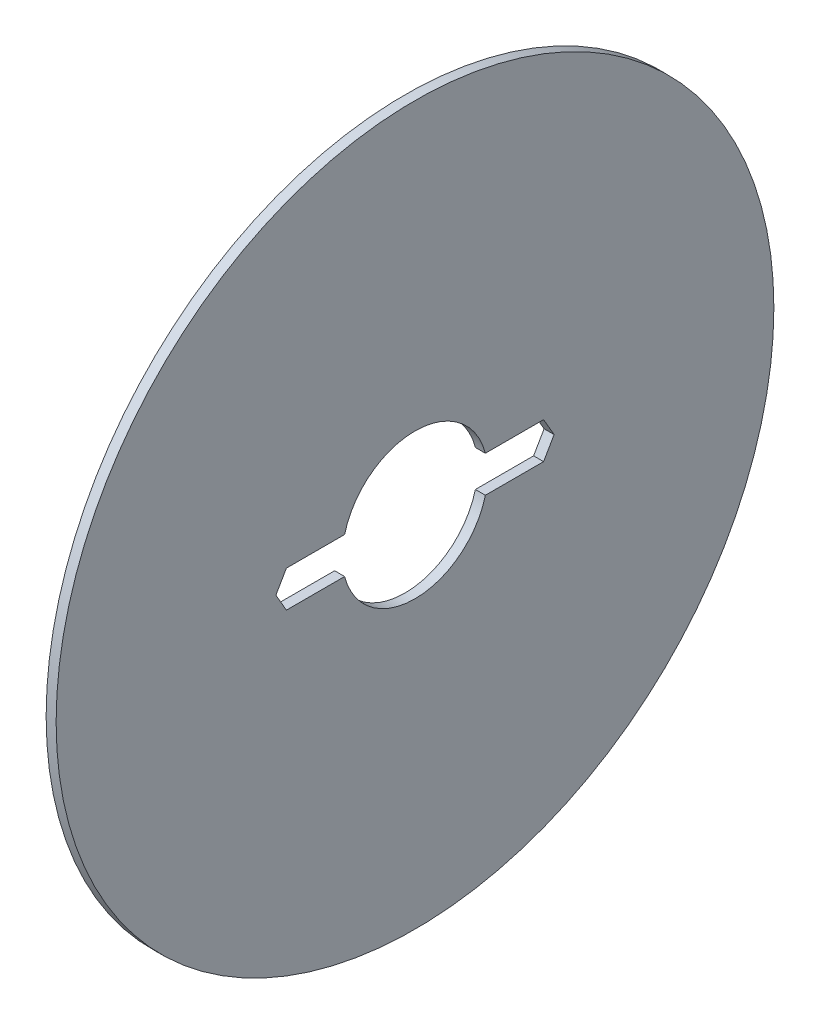
ISO-10303-21;
HEADER;
FILE_DESCRIPTION(('STEP AP214'),'2;1');
FILE_NAME('part.step','',(''),(''),'','','');
FILE_SCHEMA(('AUTOMOTIVE_DESIGN { 1 0 10303 214 1 1 1 1 }'));
ENDSEC;
DATA;
#1=APPLICATION_CONTEXT('core data for automotive mechanical design processes');
#2=APPLICATION_PROTOCOL_DEFINITION('international standard','automotive_design',2000,#1);
#3=PRODUCT_CONTEXT('',#1,'mechanical');
#4=PRODUCT('Part','Part','',(#3));
#5=PRODUCT_RELATED_PRODUCT_CATEGORY('part','',(#4));
#6=PRODUCT_DEFINITION_FORMATION('','',#4);
#7=PRODUCT_DEFINITION_CONTEXT('part definition',#1,'design');
#8=PRODUCT_DEFINITION('design','',#6,#7);
#9=PRODUCT_DEFINITION_SHAPE('','',#8);
#10=(LENGTH_UNIT() NAMED_UNIT(*) SI_UNIT(.MILLI.,.METRE.));
#11=(NAMED_UNIT(*) PLANE_ANGLE_UNIT() SI_UNIT($,.RADIAN.));
#12=(NAMED_UNIT(*) SI_UNIT($,.STERADIAN.) SOLID_ANGLE_UNIT());
#13=UNCERTAINTY_MEASURE_WITH_UNIT(LENGTH_MEASURE(1.E-05),#10,'distance_accuracy_value','');
#14=(GEOMETRIC_REPRESENTATION_CONTEXT(3) GLOBAL_UNCERTAINTY_ASSIGNED_CONTEXT((#13)) GLOBAL_UNIT_ASSIGNED_CONTEXT((#10,
#11,#12)) REPRESENTATION_CONTEXT('',''));
#15=CARTESIAN_POINT('',(0.,0.,0.));
#16=DIRECTION('',(0.,0.,1.));
#17=DIRECTION('',(1.,0.,0.));
#18=AXIS2_PLACEMENT_3D('',#15,#16,#17);
#19=CARTESIAN_POINT('',(0.55,0.,0.));
#20=DIRECTION('',(1.,0.,0.));
#21=DIRECTION('',(0.,0.,-1.));
#22=AXIS2_PLACEMENT_3D('',#19,#20,#21);
#23=PLANE('',#22);
#24=CARTESIAN_POINT('',(0.55,0.,0.));
#25=DIRECTION('',(1.,0.,0.));
#26=DIRECTION('',(0.,0.,-1.));
#27=AXIS2_PLACEMENT_3D('',#24,#25,#26);
#28=CIRCLE('',#27,19.75);
#29=CARTESIAN_POINT('',(0.55,0.,-19.75));
#30=VERTEX_POINT('',#29);
#31=EDGE_CURVE('E11',#30,#30,#28,.T.);
#32=ORIENTED_EDGE('',*,*,#31,.T.);
#33=EDGE_LOOP('',(#32));
#34=FACE_BOUND('',#33,.T.);
#35=DIRECTION('',(0.,0.,1.));
#36=VECTOR('',#35,1.);
#37=CARTESIAN_POINT('',(0.55,1.,3.87298334620742));
#38=LINE('',#37,#36);
#39=CARTESIAN_POINT('',(0.55,1.,3.87298334620742));
#40=VERTEX_POINT('',#39);
#41=CARTESIAN_POINT('',(0.55,1.,7.07735026918962));
#42=VERTEX_POINT('',#41);
#43=EDGE_CURVE('E125',#40,#42,#38,.T.);
#44=ORIENTED_EDGE('',*,*,#43,.F.);
#45=CARTESIAN_POINT('',(0.55,0.,0.));
#46=DIRECTION('',(1.,0.,0.));
#47=DIRECTION('',(0.,0.,-1.));
#48=AXIS2_PLACEMENT_3D('',#45,#46,#47);
#49=CIRCLE('',#48,4.);
#50=CARTESIAN_POINT('',(0.55,1.,-3.87298334620742));
#51=VERTEX_POINT('',#50);
#52=EDGE_CURVE('E116',#51,#40,#49,.T.);
#53=ORIENTED_EDGE('',*,*,#52,.F.);
#54=DIRECTION('',(0.,0.,1.));
#55=VECTOR('',#54,1.);
#56=CARTESIAN_POINT('',(0.55,1.,-7.07735026918962));
#57=LINE('',#56,#55);
#58=CARTESIAN_POINT('',(0.55,0.999999999999999,-7.07735026918962));
#59=VERTEX_POINT('',#58);
#60=EDGE_CURVE('E163',#59,#51,#57,.T.);
#61=ORIENTED_EDGE('',*,*,#60,.F.);
#62=DIRECTION('',(0.,0.866025403784438,0.5));
#63=VECTOR('',#62,1.);
#64=CARTESIAN_POINT('',(0.55,0.,-7.65470053837925));
#65=LINE('',#64,#63);
#66=CARTESIAN_POINT('',(0.55,0.,-7.65470053837925));
#67=VERTEX_POINT('',#66);
#68=EDGE_CURVE('E160',#67,#59,#65,.T.);
#69=ORIENTED_EDGE('',*,*,#68,.F.);
#70=DIRECTION('',(0.,0.866025403784439,-0.5));
#71=VECTOR('',#70,1.);
#72=CARTESIAN_POINT('',(0.55,-1.,-7.07735026918963));
#73=LINE('',#72,#71);
#74=CARTESIAN_POINT('',(0.55,-1.,-7.07735026918963));
#75=VERTEX_POINT('',#74);
#76=EDGE_CURVE('E157',#75,#67,#73,.T.);
#77=ORIENTED_EDGE('',*,*,#76,.F.);
#78=DIRECTION('',(0.,0.,-1.));
#79=VECTOR('',#78,1.);
#80=CARTESIAN_POINT('',(0.55,-1.,-5.92264973081037));
#81=LINE('',#80,#79);
#82=CARTESIAN_POINT('',(0.55,-1.,-3.87298334620742));
#83=VERTEX_POINT('',#82);
#84=EDGE_CURVE('E154',#83,#75,#81,.T.);
#85=ORIENTED_EDGE('',*,*,#84,.F.);
#86=CARTESIAN_POINT('',(0.55,0.,0.));
#87=DIRECTION('',(1.,0.,0.));
#88=DIRECTION('',(0.,0.,-1.));
#89=AXIS2_PLACEMENT_3D('',#86,#87,#88);
#90=CIRCLE('',#89,4.);
#91=CARTESIAN_POINT('',(0.55,-1.,3.87298334620742));
#92=VERTEX_POINT('',#91);
#93=EDGE_CURVE('E151',#92,#83,#90,.T.);
#94=ORIENTED_EDGE('',*,*,#93,.F.);
#95=DIRECTION('',(0.,0.,-1.));
#96=VECTOR('',#95,1.);
#97=CARTESIAN_POINT('',(0.55,-0.999999999999999,7.07735026918963));
#98=LINE('',#97,#96);
#99=CARTESIAN_POINT('',(0.55,-0.999999999999999,7.07735026918963));
#100=VERTEX_POINT('',#99);
#101=EDGE_CURVE('E148',#100,#92,#98,.T.);
#102=ORIENTED_EDGE('',*,*,#101,.F.);
#103=DIRECTION('',(0.,-0.86602540378444,-0.499999999999998));
#104=VECTOR('',#103,1.);
#105=CARTESIAN_POINT('',(0.55,0.,7.65470053837925));
#106=LINE('',#105,#104);
#107=CARTESIAN_POINT('',(0.55,0.,7.65470053837925));
#108=VERTEX_POINT('',#107);
#109=EDGE_CURVE('E143',#108,#100,#106,.T.);
#110=ORIENTED_EDGE('',*,*,#109,.F.);
#111=DIRECTION('',(0.,-0.866025403784438,0.500000000000002));
#112=VECTOR('',#111,1.);
#113=CARTESIAN_POINT('',(0.55,1.,7.07735026918962));
#114=LINE('',#113,#112);
#115=EDGE_CURVE('E138',#42,#108,#114,.T.);
#116=ORIENTED_EDGE('',*,*,#115,.F.);
#117=EDGE_LOOP('',(#44,#53,#61,#69,#77,#85,#94,#102,#110,#116));
#118=FACE_BOUND('',#117,.T.);
#119=ADVANCED_FACE('F38',(#34,#118),#23,.T.);
#120=CARTESIAN_POINT('',(0.,0.,0.));
#121=DIRECTION('',(1.,0.,0.));
#122=DIRECTION('',(0.,0.,-1.));
#123=AXIS2_PLACEMENT_3D('',#120,#121,#122);
#124=PLANE('',#123);
#125=CARTESIAN_POINT('',(0.,0.,0.));
#126=DIRECTION('',(1.,0.,0.));
#127=DIRECTION('',(0.,0.,-1.));
#128=AXIS2_PLACEMENT_3D('',#125,#126,#127);
#129=CIRCLE('',#128,19.75);
#130=CARTESIAN_POINT('',(0.,0.,-19.75));
#131=VERTEX_POINT('',#130);
#132=EDGE_CURVE('E42',#131,#131,#129,.T.);
#133=ORIENTED_EDGE('',*,*,#132,.F.);
#134=EDGE_LOOP('',(#133));
#135=FACE_BOUND('',#134,.T.);
#136=CARTESIAN_POINT('',(0.,0.,0.));
#137=DIRECTION('',(1.,0.,0.));
#138=DIRECTION('',(0.,0.,-1.));
#139=AXIS2_PLACEMENT_3D('',#136,#137,#138);
#140=CIRCLE('',#139,4.);
#141=CARTESIAN_POINT('',(0.,1.,-3.87298334620742));
#142=VERTEX_POINT('',#141);
#143=CARTESIAN_POINT('',(0.,1.,3.87298334620742));
#144=VERTEX_POINT('',#143);
#145=EDGE_CURVE('E62',#142,#144,#140,.T.);
#146=ORIENTED_EDGE('',*,*,#145,.T.);
#147=DIRECTION('',(0.,0.,1.));
#148=VECTOR('',#147,1.);
#149=CARTESIAN_POINT('',(0.,1.,5.92264973081037));
#150=LINE('',#149,#148);
#151=CARTESIAN_POINT('',(0.,1.,7.07735026918962));
#152=VERTEX_POINT('',#151);
#153=EDGE_CURVE('E132',#144,#152,#150,.T.);
#154=ORIENTED_EDGE('',*,*,#153,.T.);
#155=DIRECTION('',(0.,-0.866025403784438,0.500000000000002));
#156=VECTOR('',#155,1.);
#157=CARTESIAN_POINT('',(0.,1.,7.07735026918962));
#158=LINE('',#157,#156);
#159=CARTESIAN_POINT('',(0.,0.,7.65470053837925));
#160=VERTEX_POINT('',#159);
#161=EDGE_CURVE('E170',#152,#160,#158,.T.);
#162=ORIENTED_EDGE('',*,*,#161,.T.);
#163=DIRECTION('',(0.,-0.86602540378444,-0.499999999999998));
#164=VECTOR('',#163,1.);
#165=CARTESIAN_POINT('',(0.,0.,7.65470053837925));
#166=LINE('',#165,#164);
#167=CARTESIAN_POINT('',(0.,-0.999999999999999,7.07735026918963));
#168=VERTEX_POINT('',#167);
#169=EDGE_CURVE('E174',#160,#168,#166,.T.);
#170=ORIENTED_EDGE('',*,*,#169,.T.);
#171=DIRECTION('',(0.,0.,-1.));
#172=VECTOR('',#171,1.);
#173=CARTESIAN_POINT('',(0.,-1.,3.87298334620742));
#174=LINE('',#173,#172);
#175=CARTESIAN_POINT('',(0.,-1.,3.87298334620742));
#176=VERTEX_POINT('',#175);
#177=EDGE_CURVE('E178',#168,#176,#174,.T.);
#178=ORIENTED_EDGE('',*,*,#177,.T.);
#179=CARTESIAN_POINT('',(0.,0.,0.));
#180=DIRECTION('',(1.,0.,0.));
#181=DIRECTION('',(0.,0.,-1.));
#182=AXIS2_PLACEMENT_3D('',#179,#180,#181);
#183=CIRCLE('',#182,4.);
#184=CARTESIAN_POINT('',(0.,-1.,-3.87298334620742));
#185=VERTEX_POINT('',#184);
#186=EDGE_CURVE('E182',#176,#185,#183,.T.);
#187=ORIENTED_EDGE('',*,*,#186,.T.);
#188=DIRECTION('',(0.,0.,-1.));
#189=VECTOR('',#188,1.);
#190=CARTESIAN_POINT('',(0.,-1.,-6.5));
#191=LINE('',#190,#189);
#192=CARTESIAN_POINT('',(0.,-1.,-7.07735026918963));
#193=VERTEX_POINT('',#192);
#194=EDGE_CURVE('E186',#185,#193,#191,.T.);
#195=ORIENTED_EDGE('',*,*,#194,.T.);
#196=DIRECTION('',(0.,0.866025403784439,-0.5));
#197=VECTOR('',#196,1.);
#198=CARTESIAN_POINT('',(0.,-1.,-7.07735026918963));
#199=LINE('',#198,#197);
#200=CARTESIAN_POINT('',(0.,0.,-7.65470053837925));
#201=VERTEX_POINT('',#200);
#202=EDGE_CURVE('E190',#193,#201,#199,.T.);
#203=ORIENTED_EDGE('',*,*,#202,.T.);
#204=DIRECTION('',(0.,0.866025403784438,0.5));
#205=VECTOR('',#204,1.);
#206=CARTESIAN_POINT('',(0.,0.,-7.65470053837925));
#207=LINE('',#206,#205);
#208=CARTESIAN_POINT('',(0.,1.,-7.07735026918962));
#209=VERTEX_POINT('',#208);
#210=EDGE_CURVE('E194',#201,#209,#207,.T.);
#211=ORIENTED_EDGE('',*,*,#210,.T.);
#212=DIRECTION('',(0.,0.,1.));
#213=VECTOR('',#212,1.);
#214=CARTESIAN_POINT('',(0.,1.,-5.92264973081037));
#215=LINE('',#214,#213);
#216=EDGE_CURVE('E126',#209,#142,#215,.T.);
#217=ORIENTED_EDGE('',*,*,#216,.T.);
#218=EDGE_LOOP('',(#146,#154,#162,#170,#178,#187,#195,#203,#211,#217));
#219=FACE_BOUND('',#218,.T.);
#220=ADVANCED_FACE('F233',(#135,#219),#124,.F.);
#221=CARTESIAN_POINT('',(0.55,0.,0.));
#222=DIRECTION('',(-1.,0.,0.));
#223=DIRECTION('',(0.,0.,1.));
#224=AXIS2_PLACEMENT_3D('',#221,#222,#223);
#225=CYLINDRICAL_SURFACE('',#224,19.75);
#226=ORIENTED_EDGE('',*,*,#31,.F.);
#227=EDGE_LOOP('',(#226));
#228=FACE_BOUND('',#227,.T.);
#229=ORIENTED_EDGE('',*,*,#132,.T.);
#230=EDGE_LOOP('',(#229));
#231=FACE_BOUND('',#230,.T.);
#232=ADVANCED_FACE('F40',(#228,#231),#225,.T.);
#233=CARTESIAN_POINT('',(0.55,0.,0.));
#234=DIRECTION('',(-1.,0.,0.));
#235=DIRECTION('',(0.,0.,1.));
#236=AXIS2_PLACEMENT_3D('',#233,#234,#235);
#237=CYLINDRICAL_SURFACE('',#236,4.);
#238=ORIENTED_EDGE('',*,*,#145,.F.);
#239=DIRECTION('',(-1.,0.,0.));
#240=VECTOR('',#239,1.);
#241=CARTESIAN_POINT('',(0.55,1.,-3.87298334620742));
#242=LINE('',#241,#240);
#243=EDGE_CURVE('E120',#51,#142,#242,.T.);
#244=ORIENTED_EDGE('',*,*,#243,.F.);
#245=ORIENTED_EDGE('',*,*,#52,.T.);
#246=DIRECTION('',(-1.,0.,0.));
#247=VECTOR('',#246,1.);
#248=CARTESIAN_POINT('',(0.55,1.,3.87298334620742));
#249=LINE('',#248,#247);
#250=EDGE_CURVE('E119',#40,#144,#249,.T.);
#251=ORIENTED_EDGE('',*,*,#250,.T.);
#252=EDGE_LOOP('',(#238,#244,#245,#251));
#253=FACE_BOUND('',#252,.T.);
#254=ADVANCED_FACE('F118',(#253),#237,.F.);
#255=CARTESIAN_POINT('',(0.55,1.,5.92264973081037));
#256=DIRECTION('',(0.,-1.,0.));
#257=DIRECTION('',(0.,0.,-1.));
#258=AXIS2_PLACEMENT_3D('',#255,#256,#257);
#259=PLANE('',#258);
#260=ORIENTED_EDGE('',*,*,#153,.F.);
#261=ORIENTED_EDGE('',*,*,#250,.F.);
#262=ORIENTED_EDGE('',*,*,#43,.T.);
#263=DIRECTION('',(-1.,0.,0.));
#264=VECTOR('',#263,1.);
#265=CARTESIAN_POINT('',(0.55,1.,7.07735026918962));
#266=LINE('',#265,#264);
#267=EDGE_CURVE('E134',#42,#152,#266,.T.);
#268=ORIENTED_EDGE('',*,*,#267,.T.);
#269=EDGE_LOOP('',(#260,#261,#262,#268));
#270=FACE_BOUND('',#269,.T.);
#271=ADVANCED_FACE('F129',(#270),#259,.T.);
#272=CARTESIAN_POINT('',(0.55,1.,7.07735026918962));
#273=DIRECTION('',(0.,-0.500000000000002,-0.866025403784438));
#274=DIRECTION('',(0.,0.866025403784438,-0.500000000000002));
#275=AXIS2_PLACEMENT_3D('',#272,#273,#274);
#276=PLANE('',#275);
#277=ORIENTED_EDGE('',*,*,#161,.F.);
#278=ORIENTED_EDGE('',*,*,#267,.F.);
#279=ORIENTED_EDGE('',*,*,#115,.T.);
#280=DIRECTION('',(-1.,0.,0.));
#281=VECTOR('',#280,1.);
#282=CARTESIAN_POINT('',(0.55,0.,7.65470053837925));
#283=LINE('',#282,#281);
#284=EDGE_CURVE('E222',#108,#160,#283,.T.);
#285=ORIENTED_EDGE('',*,*,#284,.T.);
#286=EDGE_LOOP('',(#277,#278,#279,#285));
#287=FACE_BOUND('',#286,.T.);
#288=ADVANCED_FACE('F229',(#287),#276,.T.);
#289=CARTESIAN_POINT('',(0.55,0.,7.65470053837925));
#290=DIRECTION('',(0.,0.499999999999998,-0.86602540378444));
#291=DIRECTION('',(0.,0.86602540378444,0.499999999999998));
#292=AXIS2_PLACEMENT_3D('',#289,#290,#291);
#293=PLANE('',#292);
#294=ORIENTED_EDGE('',*,*,#169,.F.);
#295=ORIENTED_EDGE('',*,*,#284,.F.);
#296=ORIENTED_EDGE('',*,*,#109,.T.);
#297=DIRECTION('',(-1.,0.,0.));
#298=VECTOR('',#297,1.);
#299=CARTESIAN_POINT('',(0.55,-0.999999999999999,7.07735026918963));
#300=LINE('',#299,#298);
#301=EDGE_CURVE('E218',#100,#168,#300,.T.);
#302=ORIENTED_EDGE('',*,*,#301,.T.);
#303=EDGE_LOOP('',(#294,#295,#296,#302));
#304=FACE_BOUND('',#303,.T.);
#305=ADVANCED_FACE('F259',(#304),#293,.T.);
#306=CARTESIAN_POINT('',(0.55,-1.,3.87298334620742));
#307=DIRECTION('',(0.,1.,0.));
#308=DIRECTION('',(0.,0.,1.));
#309=AXIS2_PLACEMENT_3D('',#306,#307,#308);
#310=PLANE('',#309);
#311=ORIENTED_EDGE('',*,*,#177,.F.);
#312=ORIENTED_EDGE('',*,*,#301,.F.);
#313=ORIENTED_EDGE('',*,*,#101,.T.);
#314=DIRECTION('',(-1.,0.,0.));
#315=VECTOR('',#314,1.);
#316=CARTESIAN_POINT('',(0.55,-1.,3.87298334620742));
#317=LINE('',#316,#315);
#318=EDGE_CURVE('E215',#92,#176,#317,.T.);
#319=ORIENTED_EDGE('',*,*,#318,.T.);
#320=EDGE_LOOP('',(#311,#312,#313,#319));
#321=FACE_BOUND('',#320,.T.);
#322=ADVANCED_FACE('F256',(#321),#310,.T.);
#323=CARTESIAN_POINT('',(0.55,0.,0.));
#324=DIRECTION('',(-1.,0.,0.));
#325=DIRECTION('',(0.,0.,1.));
#326=AXIS2_PLACEMENT_3D('',#323,#324,#325);
#327=CYLINDRICAL_SURFACE('',#326,4.);
#328=ORIENTED_EDGE('',*,*,#186,.F.);
#329=ORIENTED_EDGE('',*,*,#318,.F.);
#330=ORIENTED_EDGE('',*,*,#93,.T.);
#331=DIRECTION('',(-1.,0.,0.));
#332=VECTOR('',#331,1.);
#333=CARTESIAN_POINT('',(0.55,-1.,-3.87298334620742));
#334=LINE('',#333,#332);
#335=EDGE_CURVE('E211',#83,#185,#334,.T.);
#336=ORIENTED_EDGE('',*,*,#335,.T.);
#337=EDGE_LOOP('',(#328,#329,#330,#336));
#338=FACE_BOUND('',#337,.T.);
#339=ADVANCED_FACE('F252',(#338),#327,.F.);
#340=CARTESIAN_POINT('',(0.55,-1.,-6.5));
#341=DIRECTION('',(0.,1.,0.));
#342=DIRECTION('',(0.,0.,1.));
#343=AXIS2_PLACEMENT_3D('',#340,#341,#342);
#344=PLANE('',#343);
#345=ORIENTED_EDGE('',*,*,#194,.F.);
#346=ORIENTED_EDGE('',*,*,#335,.F.);
#347=ORIENTED_EDGE('',*,*,#84,.T.);
#348=DIRECTION('',(-1.,0.,0.));
#349=VECTOR('',#348,1.);
#350=CARTESIAN_POINT('',(0.55,-1.,-7.07735026918963));
#351=LINE('',#350,#349);
#352=EDGE_CURVE('E208',#75,#193,#351,.T.);
#353=ORIENTED_EDGE('',*,*,#352,.T.);
#354=EDGE_LOOP('',(#345,#346,#347,#353));
#355=FACE_BOUND('',#354,.T.);
#356=ADVANCED_FACE('F248',(#355),#344,.T.);
#357=CARTESIAN_POINT('',(0.55,-1.,-7.07735026918963));
#358=DIRECTION('',(0.,0.5,0.866025403784439));
#359=DIRECTION('',(0.,-0.866025403784439,0.5));
#360=AXIS2_PLACEMENT_3D('',#357,#358,#359);
#361=PLANE('',#360);
#362=ORIENTED_EDGE('',*,*,#202,.F.);
#363=ORIENTED_EDGE('',*,*,#352,.F.);
#364=ORIENTED_EDGE('',*,*,#76,.T.);
#365=DIRECTION('',(-1.,0.,0.));
#366=VECTOR('',#365,1.);
#367=CARTESIAN_POINT('',(0.55,0.,-7.65470053837925));
#368=LINE('',#367,#366);
#369=EDGE_CURVE('E205',#67,#201,#368,.T.);
#370=ORIENTED_EDGE('',*,*,#369,.T.);
#371=EDGE_LOOP('',(#362,#363,#364,#370));
#372=FACE_BOUND('',#371,.T.);
#373=ADVANCED_FACE('F246',(#372),#361,.T.);
#374=CARTESIAN_POINT('',(0.55,0.,-7.65470053837925));
#375=DIRECTION('',(0.,-0.5,0.866025403784438));
#376=DIRECTION('',(0.,-0.866025403784439,-0.5));
#377=AXIS2_PLACEMENT_3D('',#374,#375,#376);
#378=PLANE('',#377);
#379=ORIENTED_EDGE('',*,*,#210,.F.);
#380=ORIENTED_EDGE('',*,*,#369,.F.);
#381=ORIENTED_EDGE('',*,*,#68,.T.);
#382=DIRECTION('',(-1.,0.,0.));
#383=VECTOR('',#382,1.);
#384=CARTESIAN_POINT('',(0.55,1.,-7.07735026918962));
#385=LINE('',#384,#383);
#386=EDGE_CURVE('E54',#59,#209,#385,.T.);
#387=ORIENTED_EDGE('',*,*,#386,.T.);
#388=EDGE_LOOP('',(#379,#380,#381,#387));
#389=FACE_BOUND('',#388,.T.);
#390=ADVANCED_FACE('F237',(#389),#378,.T.);
#391=CARTESIAN_POINT('',(0.55,1.,-5.92264973081037));
#392=DIRECTION('',(0.,-1.,0.));
#393=DIRECTION('',(0.,0.,-1.));
#394=AXIS2_PLACEMENT_3D('',#391,#392,#393);
#395=PLANE('',#394);
#396=ORIENTED_EDGE('',*,*,#216,.F.);
#397=ORIENTED_EDGE('',*,*,#386,.F.);
#398=ORIENTED_EDGE('',*,*,#60,.T.);
#399=ORIENTED_EDGE('',*,*,#243,.T.);
#400=EDGE_LOOP('',(#396,#397,#398,#399));
#401=FACE_BOUND('',#400,.T.);
#402=ADVANCED_FACE('F235',(#401),#395,.T.);
#403=CLOSED_SHELL('',(#119,#220,#232,#254,#271,#288,#305,#322,#339,#356,#373,#390,#402));
#404=MANIFOLD_SOLID_BREP('B2',#403);
#405=ADVANCED_BREP_SHAPE_REPRESENTATION('',(#18,#404),#14);
#406=SHAPE_DEFINITION_REPRESENTATION(#9,#405);
ENDSEC;
END-ISO-10303-21;
